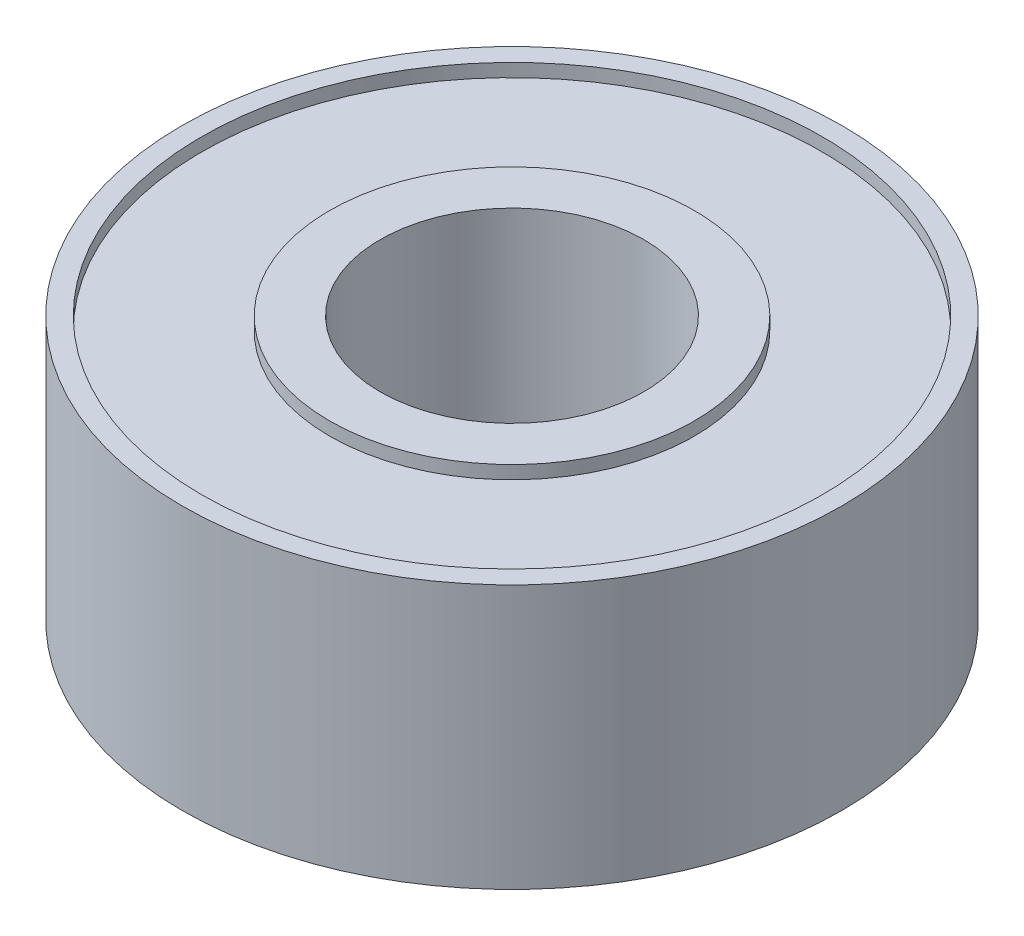
ISO-10303-21;
HEADER;
FILE_DESCRIPTION(('STEP AP214'),'2;1');
FILE_NAME('part.step','',(''),(''),'','','');
FILE_SCHEMA(('AUTOMOTIVE_DESIGN { 1 0 10303 214 1 1 1 1 }'));
ENDSEC;
DATA;
#1=APPLICATION_CONTEXT('core data for automotive mechanical design processes');
#2=APPLICATION_PROTOCOL_DEFINITION('international standard','automotive_design',2000,#1);
#3=PRODUCT_CONTEXT('',#1,'mechanical');
#4=PRODUCT('Part','Part','',(#3));
#5=PRODUCT_RELATED_PRODUCT_CATEGORY('part','',(#4));
#6=PRODUCT_DEFINITION_FORMATION('','',#4);
#7=PRODUCT_DEFINITION_CONTEXT('part definition',#1,'design');
#8=PRODUCT_DEFINITION('design','',#6,#7);
#9=PRODUCT_DEFINITION_SHAPE('','',#8);
#10=(LENGTH_UNIT() NAMED_UNIT(*) SI_UNIT(.MILLI.,.METRE.));
#11=(NAMED_UNIT(*) PLANE_ANGLE_UNIT() SI_UNIT($,.RADIAN.));
#12=(NAMED_UNIT(*) SI_UNIT($,.STERADIAN.) SOLID_ANGLE_UNIT());
#13=UNCERTAINTY_MEASURE_WITH_UNIT(LENGTH_MEASURE(1.E-05),#10,'distance_accuracy_value','');
#14=(GEOMETRIC_REPRESENTATION_CONTEXT(3) GLOBAL_UNCERTAINTY_ASSIGNED_CONTEXT((#13)) GLOBAL_UNIT_ASSIGNED_CONTEXT((#10,
#11,#12)) REPRESENTATION_CONTEXT('',''));
#15=CARTESIAN_POINT('',(0.,0.,0.));
#16=DIRECTION('',(0.,0.,1.));
#17=DIRECTION('',(1.,0.,0.));
#18=AXIS2_PLACEMENT_3D('',#15,#16,#17);
#19=CARTESIAN_POINT('',(0.,-1.,0.));
#20=DIRECTION('',(0.,1.,0.));
#21=DIRECTION('',(0.,0.,1.));
#22=AXIS2_PLACEMENT_3D('',#19,#20,#21);
#23=PLANE('',#22);
#24=CARTESIAN_POINT('',(0.,-1.,0.));
#25=DIRECTION('',(0.,1.,0.));
#26=DIRECTION('',(0.,0.,1.));
#27=AXIS2_PLACEMENT_3D('',#24,#25,#26);
#28=CIRCLE('',#27,1.);
#29=CARTESIAN_POINT('',(0.,-1.,1.));
#30=VERTEX_POINT('',#29);
#31=EDGE_CURVE('E58',#30,#30,#28,.T.);
#32=ORIENTED_EDGE('',*,*,#31,.T.);
#33=EDGE_LOOP('',(#32));
#34=FACE_BOUND('',#33,.T.);
#35=CARTESIAN_POINT('',(0.,-1.,0.));
#36=DIRECTION('',(0.,1.,0.));
#37=DIRECTION('',(0.,0.,1.));
#38=AXIS2_PLACEMENT_3D('',#35,#36,#37);
#39=CIRCLE('',#38,1.38245434408832);
#40=CARTESIAN_POINT('',(0.,-1.,1.38245434408832));
#41=VERTEX_POINT('',#40);
#42=EDGE_CURVE('E90',#41,#41,#39,.T.);
#43=ORIENTED_EDGE('',*,*,#42,.F.);
#44=EDGE_LOOP('',(#43));
#45=FACE_BOUND('',#44,.T.);
#46=ADVANCED_FACE('F43',(#34,#45),#23,.F.);
#47=CARTESIAN_POINT('',(0.,1.,0.));
#48=DIRECTION('',(0.,1.,0.));
#49=DIRECTION('',(0.,0.,1.));
#50=AXIS2_PLACEMENT_3D('',#47,#48,#49);
#51=PLANE('',#50);
#52=CARTESIAN_POINT('',(0.,1.,0.));
#53=DIRECTION('',(0.,1.,0.));
#54=DIRECTION('',(0.,0.,1.));
#55=AXIS2_PLACEMENT_3D('',#52,#53,#54);
#56=CIRCLE('',#55,1.);
#57=CARTESIAN_POINT('',(0.,1.,1.));
#58=VERTEX_POINT('',#57);
#59=EDGE_CURVE('E56',#58,#58,#56,.T.);
#60=ORIENTED_EDGE('',*,*,#59,.F.);
#61=EDGE_LOOP('',(#60));
#62=FACE_BOUND('',#61,.T.);
#63=CARTESIAN_POINT('',(0.,1.,0.));
#64=DIRECTION('',(0.,1.,0.));
#65=DIRECTION('',(0.,0.,1.));
#66=AXIS2_PLACEMENT_3D('',#63,#64,#65);
#67=CIRCLE('',#66,1.38245434408832);
#68=CARTESIAN_POINT('',(0.,1.,1.38245434408832));
#69=VERTEX_POINT('',#68);
#70=EDGE_CURVE('E74',#69,#69,#67,.T.);
#71=ORIENTED_EDGE('',*,*,#70,.T.);
#72=EDGE_LOOP('',(#71));
#73=FACE_BOUND('',#72,.T.);
#74=ADVANCED_FACE('F108',(#62,#73),#51,.T.);
#75=CARTESIAN_POINT('',(0.,1.,0.));
#76=DIRECTION('',(0.,1.,0.));
#77=DIRECTION('',(0.,0.,1.));
#78=AXIS2_PLACEMENT_3D('',#75,#76,#77);
#79=CIRCLE('',#78,2.35241825782487);
#80=CARTESIAN_POINT('',(0.,1.,2.35241825782487));
#81=VERTEX_POINT('',#80);
#82=EDGE_CURVE('E66',#81,#81,#79,.T.);
#83=ORIENTED_EDGE('',*,*,#82,.F.);
#84=EDGE_LOOP('',(#83));
#85=FACE_BOUND('',#84,.T.);
#86=CARTESIAN_POINT('',(0.,1.,0.));
#87=DIRECTION('',(0.,1.,0.));
#88=DIRECTION('',(0.,0.,1.));
#89=AXIS2_PLACEMENT_3D('',#86,#87,#88);
#90=CIRCLE('',#89,2.5);
#91=CARTESIAN_POINT('',(0.,1.,2.5));
#92=VERTEX_POINT('',#91);
#93=EDGE_CURVE('E10',#92,#92,#90,.T.);
#94=ORIENTED_EDGE('',*,*,#93,.T.);
#95=EDGE_LOOP('',(#94));
#96=FACE_BOUND('',#95,.T.);
#97=ADVANCED_FACE('F114',(#85,#96),#51,.T.);
#98=CARTESIAN_POINT('',(0.,-1.,0.));
#99=DIRECTION('',(0.,1.,0.));
#100=DIRECTION('',(0.,0.,1.));
#101=AXIS2_PLACEMENT_3D('',#98,#99,#100);
#102=CIRCLE('',#101,2.35241825782487);
#103=CARTESIAN_POINT('',(0.,-1.,2.35241825782487));
#104=VERTEX_POINT('',#103);
#105=EDGE_CURVE('E82',#104,#104,#102,.T.);
#106=ORIENTED_EDGE('',*,*,#105,.T.);
#107=EDGE_LOOP('',(#106));
#108=FACE_BOUND('',#107,.T.);
#109=CARTESIAN_POINT('',(0.,-1.,0.));
#110=DIRECTION('',(0.,1.,0.));
#111=DIRECTION('',(0.,0.,1.));
#112=AXIS2_PLACEMENT_3D('',#109,#110,#111);
#113=CIRCLE('',#112,2.5);
#114=CARTESIAN_POINT('',(0.,-1.,2.5));
#115=VERTEX_POINT('',#114);
#116=EDGE_CURVE('E47',#115,#115,#113,.T.);
#117=ORIENTED_EDGE('',*,*,#116,.F.);
#118=EDGE_LOOP('',(#117));
#119=FACE_BOUND('',#118,.T.);
#120=ADVANCED_FACE('F110',(#108,#119),#23,.F.);
#121=CARTESIAN_POINT('',(0.,1.,0.));
#122=DIRECTION('',(0.,-1.,0.));
#123=DIRECTION('',(0.,0.,-1.));
#124=AXIS2_PLACEMENT_3D('',#121,#122,#123);
#125=CYLINDRICAL_SURFACE('',#124,2.5);
#126=ORIENTED_EDGE('',*,*,#93,.F.);
#127=EDGE_LOOP('',(#126));
#128=FACE_BOUND('',#127,.T.);
#129=ORIENTED_EDGE('',*,*,#116,.T.);
#130=EDGE_LOOP('',(#129));
#131=FACE_BOUND('',#130,.T.);
#132=ADVANCED_FACE('F45',(#128,#131),#125,.T.);
#133=CARTESIAN_POINT('',(0.,1.,0.));
#134=DIRECTION('',(0.,-1.,0.));
#135=DIRECTION('',(0.,0.,-1.));
#136=AXIS2_PLACEMENT_3D('',#133,#134,#135);
#137=CYLINDRICAL_SURFACE('',#136,1.);
#138=ORIENTED_EDGE('',*,*,#59,.T.);
#139=EDGE_LOOP('',(#138));
#140=FACE_BOUND('',#139,.T.);
#141=ORIENTED_EDGE('',*,*,#31,.F.);
#142=EDGE_LOOP('',(#141));
#143=FACE_BOUND('',#142,.T.);
#144=ADVANCED_FACE('F123',(#140,#143),#137,.F.);
#145=CARTESIAN_POINT('',(0.,0.9,0.));
#146=DIRECTION('',(0.,1.,0.));
#147=DIRECTION('',(0.,0.,1.));
#148=AXIS2_PLACEMENT_3D('',#145,#146,#147);
#149=CYLINDRICAL_SURFACE('',#148,2.35241825782487);
#150=CARTESIAN_POINT('',(0.,0.9,0.));
#151=DIRECTION('',(0.,1.,0.));
#152=DIRECTION('',(0.,0.,1.));
#153=AXIS2_PLACEMENT_3D('',#150,#151,#152);
#154=CIRCLE('',#153,2.35241825782487);
#155=CARTESIAN_POINT('',(0.,0.9,2.35241825782487));
#156=VERTEX_POINT('',#155);
#157=EDGE_CURVE('E62',#156,#156,#154,.T.);
#158=ORIENTED_EDGE('',*,*,#157,.F.);
#159=EDGE_LOOP('',(#158));
#160=FACE_BOUND('',#159,.T.);
#161=ORIENTED_EDGE('',*,*,#82,.T.);
#162=EDGE_LOOP('',(#161));
#163=FACE_BOUND('',#162,.T.);
#164=ADVANCED_FACE('F147',(#160,#163),#149,.F.);
#165=CARTESIAN_POINT('',(0.,0.9,0.));
#166=DIRECTION('',(0.,1.,0.));
#167=DIRECTION('',(0.,0.,1.));
#168=AXIS2_PLACEMENT_3D('',#165,#166,#167);
#169=PLANE('',#168);
#170=CARTESIAN_POINT('',(0.,0.9,0.));
#171=DIRECTION('',(0.,1.,0.));
#172=DIRECTION('',(0.,0.,1.));
#173=AXIS2_PLACEMENT_3D('',#170,#171,#172);
#174=CIRCLE('',#173,1.38245434408832);
#175=CARTESIAN_POINT('',(0.,0.9,1.38245434408832));
#176=VERTEX_POINT('',#175);
#177=EDGE_CURVE('E70',#176,#176,#174,.T.);
#178=ORIENTED_EDGE('',*,*,#177,.F.);
#179=EDGE_LOOP('',(#178));
#180=FACE_BOUND('',#179,.T.);
#181=ORIENTED_EDGE('',*,*,#157,.T.);
#182=EDGE_LOOP('',(#181));
#183=FACE_BOUND('',#182,.T.);
#184=ADVANCED_FACE('F143',(#180,#183),#169,.T.);
#185=CARTESIAN_POINT('',(0.,0.9,0.));
#186=DIRECTION('',(0.,1.,0.));
#187=DIRECTION('',(0.,0.,1.));
#188=AXIS2_PLACEMENT_3D('',#185,#186,#187);
#189=CYLINDRICAL_SURFACE('',#188,1.38245434408832);
#190=ORIENTED_EDGE('',*,*,#177,.T.);
#191=EDGE_LOOP('',(#190));
#192=FACE_BOUND('',#191,.T.);
#193=ORIENTED_EDGE('',*,*,#70,.F.);
#194=EDGE_LOOP('',(#193));
#195=FACE_BOUND('',#194,.T.);
#196=ADVANCED_FACE('F137',(#192,#195),#189,.T.);
#197=CARTESIAN_POINT('',(0.,-0.9,0.));
#198=DIRECTION('',(0.,-1.,0.));
#199=DIRECTION('',(0.,0.,1.));
#200=AXIS2_PLACEMENT_3D('',#197,#198,#199);
#201=PLANE('',#200);
#202=CARTESIAN_POINT('',(0.,-0.9,0.));
#203=DIRECTION('',(0.,1.,0.));
#204=DIRECTION('',(0.,0.,1.));
#205=AXIS2_PLACEMENT_3D('',#202,#203,#204);
#206=CIRCLE('',#205,2.35241825782487);
#207=CARTESIAN_POINT('',(0.,-0.9,2.35241825782487));
#208=VERTEX_POINT('',#207);
#209=EDGE_CURVE('E78',#208,#208,#206,.T.);
#210=ORIENTED_EDGE('',*,*,#209,.F.);
#211=EDGE_LOOP('',(#210));
#212=FACE_BOUND('',#211,.T.);
#213=CARTESIAN_POINT('',(0.,-0.9,0.));
#214=DIRECTION('',(0.,1.,0.));
#215=DIRECTION('',(0.,0.,1.));
#216=AXIS2_PLACEMENT_3D('',#213,#214,#215);
#217=CIRCLE('',#216,1.38245434408832);
#218=CARTESIAN_POINT('',(0.,-0.9,1.38245434408832));
#219=VERTEX_POINT('',#218);
#220=EDGE_CURVE('E86',#219,#219,#217,.T.);
#221=ORIENTED_EDGE('',*,*,#220,.T.);
#222=EDGE_LOOP('',(#221));
#223=FACE_BOUND('',#222,.T.);
#224=ADVANCED_FACE('F98',(#212,#223),#201,.T.);
#225=CARTESIAN_POINT('',(0.,-0.9,0.));
#226=DIRECTION('',(0.,-1.,0.));
#227=DIRECTION('',(0.,0.,-1.));
#228=AXIS2_PLACEMENT_3D('',#225,#226,#227);
#229=CYLINDRICAL_SURFACE('',#228,2.35241825782487);
#230=ORIENTED_EDGE('',*,*,#209,.T.);
#231=EDGE_LOOP('',(#230));
#232=FACE_BOUND('',#231,.T.);
#233=ORIENTED_EDGE('',*,*,#105,.F.);
#234=EDGE_LOOP('',(#233));
#235=FACE_BOUND('',#234,.T.);
#236=ADVANCED_FACE('F103',(#232,#235),#229,.F.);
#237=CARTESIAN_POINT('',(0.,-0.9,0.));
#238=DIRECTION('',(0.,-1.,0.));
#239=DIRECTION('',(0.,0.,-1.));
#240=AXIS2_PLACEMENT_3D('',#237,#238,#239);
#241=CYLINDRICAL_SURFACE('',#240,1.38245434408832);
#242=ORIENTED_EDGE('',*,*,#220,.F.);
#243=EDGE_LOOP('',(#242));
#244=FACE_BOUND('',#243,.T.);
#245=ORIENTED_EDGE('',*,*,#42,.T.);
#246=EDGE_LOOP('',(#245));
#247=FACE_BOUND('',#246,.T.);
#248=ADVANCED_FACE('F100',(#244,#247),#241,.T.);
#249=CLOSED_SHELL('',(#46,#74,#97,#120,#132,#144,#164,#184,#196,#224,#236,#248));
#250=MANIFOLD_SOLID_BREP('B2',#249);
#251=ADVANCED_BREP_SHAPE_REPRESENTATION('',(#18,#250),#14);
#252=SHAPE_DEFINITION_REPRESENTATION(#9,#251);
ENDSEC;
END-ISO-10303-21;
